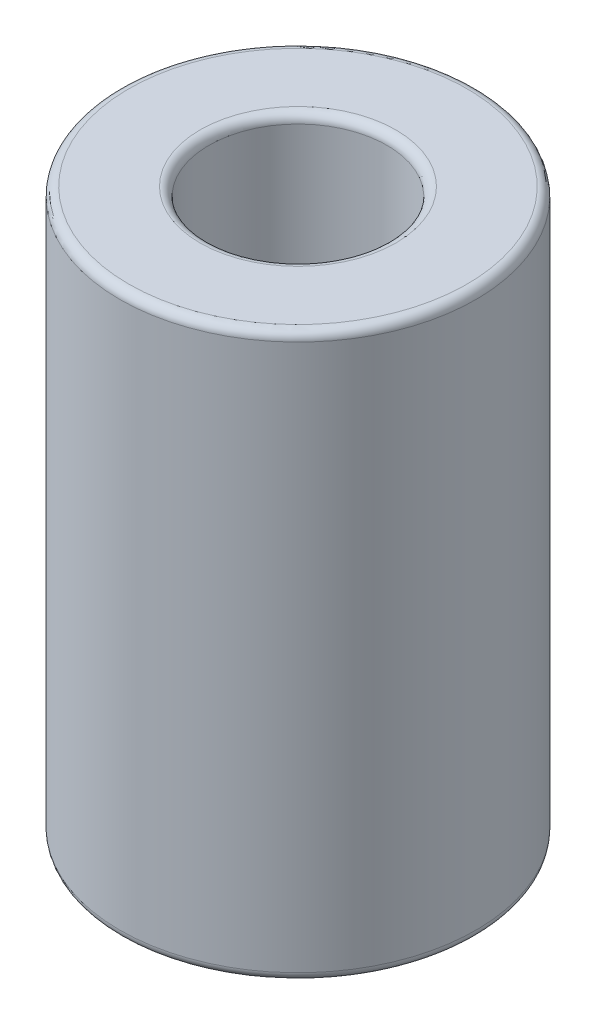
ISO-10303-21;
HEADER;
FILE_DESCRIPTION(('STEP AP214'),'2;1');
FILE_NAME('part.step','',(''),(''),'','','');
FILE_SCHEMA(('AUTOMOTIVE_DESIGN { 1 0 10303 214 1 1 1 1 }'));
ENDSEC;
DATA;
#1=APPLICATION_CONTEXT('core data for automotive mechanical design processes');
#2=APPLICATION_PROTOCOL_DEFINITION('international standard','automotive_design',2000,#1);
#3=PRODUCT_CONTEXT('',#1,'mechanical');
#4=PRODUCT('Part','Part','',(#3));
#5=PRODUCT_RELATED_PRODUCT_CATEGORY('part','',(#4));
#6=PRODUCT_DEFINITION_FORMATION('','',#4);
#7=PRODUCT_DEFINITION_CONTEXT('part definition',#1,'design');
#8=PRODUCT_DEFINITION('design','',#6,#7);
#9=PRODUCT_DEFINITION_SHAPE('','',#8);
#10=(LENGTH_UNIT() NAMED_UNIT(*) SI_UNIT(.MILLI.,.METRE.));
#11=(NAMED_UNIT(*) PLANE_ANGLE_UNIT() SI_UNIT($,.RADIAN.));
#12=(NAMED_UNIT(*) SI_UNIT($,.STERADIAN.) SOLID_ANGLE_UNIT());
#13=UNCERTAINTY_MEASURE_WITH_UNIT(LENGTH_MEASURE(1.E-05),#10,'distance_accuracy_value','');
#14=(GEOMETRIC_REPRESENTATION_CONTEXT(3) GLOBAL_UNCERTAINTY_ASSIGNED_CONTEXT((#13)) GLOBAL_UNIT_ASSIGNED_CONTEXT((#10,
#11,#12)) REPRESENTATION_CONTEXT('',''));
#15=CARTESIAN_POINT('',(0.,0.,0.));
#16=DIRECTION('',(0.,0.,1.));
#17=DIRECTION('',(1.,0.,0.));
#18=AXIS2_PLACEMENT_3D('',#15,#16,#17);
#19=CARTESIAN_POINT('',(0.,19.,0.));
#20=DIRECTION('',(0.,1.,0.));
#21=DIRECTION('',(0.,0.,1.));
#22=AXIS2_PLACEMENT_3D('',#19,#20,#21);
#23=PLANE('',#22);
#24=CARTESIAN_POINT('',(0.,19.,0.));
#25=DIRECTION('',(0.,1.,0.));
#26=DIRECTION('',(0.,0.,1.));
#27=AXIS2_PLACEMENT_3D('',#24,#25,#26);
#28=CIRCLE('',#27,3.3);
#29=CARTESIAN_POINT('',(0.,19.,3.3));
#30=VERTEX_POINT('',#29);
#31=EDGE_CURVE('E10',#30,#30,#28,.F.);
#32=ORIENTED_EDGE('',*,*,#31,.T.);
#33=EDGE_LOOP('',(#32));
#34=FACE_BOUND('',#33,.T.);
#35=CARTESIAN_POINT('',(0.,19.,0.));
#36=DIRECTION('',(0.,1.,0.));
#37=DIRECTION('',(0.,0.,1.));
#38=AXIS2_PLACEMENT_3D('',#35,#36,#37);
#39=CIRCLE('',#38,5.7);
#40=CARTESIAN_POINT('',(0.,19.,5.7));
#41=VERTEX_POINT('',#40);
#42=EDGE_CURVE('E37',#41,#41,#39,.T.);
#43=ORIENTED_EDGE('',*,*,#42,.T.);
#44=EDGE_LOOP('',(#43));
#45=FACE_BOUND('',#44,.T.);
#46=ADVANCED_FACE('F30',(#34,#45),#23,.T.);
#47=CARTESIAN_POINT('',(0.,0.,0.));
#48=DIRECTION('',(0.,1.,0.));
#49=DIRECTION('',(0.,0.,1.));
#50=AXIS2_PLACEMENT_3D('',#47,#48,#49);
#51=PLANE('',#50);
#52=CARTESIAN_POINT('',(0.,0.,0.));
#53=DIRECTION('',(0.,1.,0.));
#54=DIRECTION('',(0.,0.,1.));
#55=AXIS2_PLACEMENT_3D('',#52,#53,#54);
#56=CIRCLE('',#55,5.7);
#57=CARTESIAN_POINT('',(0.,0.,5.7));
#58=VERTEX_POINT('',#57);
#59=EDGE_CURVE('E50',#58,#58,#56,.F.);
#60=ORIENTED_EDGE('',*,*,#59,.T.);
#61=EDGE_LOOP('',(#60));
#62=FACE_BOUND('',#61,.T.);
#63=CARTESIAN_POINT('',(0.,0.,0.));
#64=DIRECTION('',(0.,1.,0.));
#65=DIRECTION('',(0.,0.,1.));
#66=AXIS2_PLACEMENT_3D('',#63,#64,#65);
#67=CIRCLE('',#66,3.3);
#68=CARTESIAN_POINT('',(0.,0.,3.3));
#69=VERTEX_POINT('',#68);
#70=EDGE_CURVE('E53',#69,#69,#67,.T.);
#71=ORIENTED_EDGE('',*,*,#70,.T.);
#72=EDGE_LOOP('',(#71));
#73=FACE_BOUND('',#72,.T.);
#74=ADVANCED_FACE('F74',(#62,#73),#51,.F.);
#75=CARTESIAN_POINT('',(0.,19.,0.));
#76=DIRECTION('',(0.,-1.,0.));
#77=DIRECTION('',(0.,0.,-1.));
#78=AXIS2_PLACEMENT_3D('',#75,#76,#77);
#79=CYLINDRICAL_SURFACE('',#78,6.);
#80=CARTESIAN_POINT('',(0.,0.300000000000002,0.));
#81=DIRECTION('',(0.,1.,0.));
#82=DIRECTION('',(0.,0.,1.));
#83=AXIS2_PLACEMENT_3D('',#80,#81,#82);
#84=CIRCLE('',#83,6.);
#85=CARTESIAN_POINT('',(0.,0.300000000000002,6.));
#86=VERTEX_POINT('',#85);
#87=EDGE_CURVE('E56',#86,#86,#84,.T.);
#88=ORIENTED_EDGE('',*,*,#87,.T.);
#89=EDGE_LOOP('',(#88));
#90=FACE_BOUND('',#89,.T.);
#91=CARTESIAN_POINT('',(0.,18.7,0.));
#92=DIRECTION('',(0.,1.,0.));
#93=DIRECTION('',(0.,0.,1.));
#94=AXIS2_PLACEMENT_3D('',#91,#92,#93);
#95=CIRCLE('',#94,6.);
#96=CARTESIAN_POINT('',(0.,18.7,6.));
#97=VERTEX_POINT('',#96);
#98=EDGE_CURVE('E59',#97,#97,#95,.F.);
#99=ORIENTED_EDGE('',*,*,#98,.T.);
#100=EDGE_LOOP('',(#99));
#101=FACE_BOUND('',#100,.T.);
#102=ADVANCED_FACE('F63',(#90,#101),#79,.T.);
#103=CARTESIAN_POINT('',(0.,19.,0.));
#104=DIRECTION('',(0.,-1.,0.));
#105=DIRECTION('',(0.,0.,-1.));
#106=AXIS2_PLACEMENT_3D('',#103,#104,#105);
#107=CYLINDRICAL_SURFACE('',#106,3.);
#108=CARTESIAN_POINT('',(0.,0.300000000000002,0.));
#109=DIRECTION('',(0.,1.,0.));
#110=DIRECTION('',(0.,0.,1.));
#111=AXIS2_PLACEMENT_3D('',#108,#109,#110);
#112=CIRCLE('',#111,3.);
#113=CARTESIAN_POINT('',(0.,0.300000000000002,3.));
#114=VERTEX_POINT('',#113);
#115=EDGE_CURVE('E41',#114,#114,#112,.F.);
#116=ORIENTED_EDGE('',*,*,#115,.T.);
#117=EDGE_LOOP('',(#116));
#118=FACE_BOUND('',#117,.T.);
#119=CARTESIAN_POINT('',(0.,18.7,0.));
#120=DIRECTION('',(0.,1.,0.));
#121=DIRECTION('',(0.,0.,1.));
#122=AXIS2_PLACEMENT_3D('',#119,#120,#121);
#123=CIRCLE('',#122,3.);
#124=CARTESIAN_POINT('',(0.,18.7,3.));
#125=VERTEX_POINT('',#124);
#126=EDGE_CURVE('E45',#125,#125,#123,.T.);
#127=ORIENTED_EDGE('',*,*,#126,.T.);
#128=EDGE_LOOP('',(#127));
#129=FACE_BOUND('',#128,.T.);
#130=ADVANCED_FACE('F82',(#118,#129),#107,.F.);
#131=CARTESIAN_POINT('',(0.,0.300000000000002,0.));
#132=DIRECTION('',(0.,1.,0.));
#133=DIRECTION('',(0.,0.,1.));
#134=AXIS2_PLACEMENT_3D('',#131,#132,#133);
#135=TOROIDAL_SURFACE('',#134,5.7,0.3);
#136=ORIENTED_EDGE('',*,*,#59,.F.);
#137=EDGE_LOOP('',(#136));
#138=FACE_BOUND('',#137,.T.);
#139=ORIENTED_EDGE('',*,*,#87,.F.);
#140=EDGE_LOOP('',(#139));
#141=FACE_BOUND('',#140,.T.);
#142=ADVANCED_FACE('F87',(#138,#141),#135,.T.);
#143=CARTESIAN_POINT('',(0.,0.300000000000002,0.));
#144=DIRECTION('',(0.,1.,0.));
#145=DIRECTION('',(0.,0.,1.));
#146=AXIS2_PLACEMENT_3D('',#143,#144,#145);
#147=TOROIDAL_SURFACE('',#146,3.3,0.3);
#148=ORIENTED_EDGE('',*,*,#115,.F.);
#149=EDGE_LOOP('',(#148));
#150=FACE_BOUND('',#149,.T.);
#151=ORIENTED_EDGE('',*,*,#70,.F.);
#152=EDGE_LOOP('',(#151));
#153=FACE_BOUND('',#152,.T.);
#154=ADVANCED_FACE('F71',(#150,#153),#147,.T.);
#155=CARTESIAN_POINT('',(0.,18.7,0.));
#156=DIRECTION('',(0.,1.,0.));
#157=DIRECTION('',(0.,0.,1.));
#158=AXIS2_PLACEMENT_3D('',#155,#156,#157);
#159=TOROIDAL_SURFACE('',#158,3.3,0.3);
#160=ORIENTED_EDGE('',*,*,#31,.F.);
#161=EDGE_LOOP('',(#160));
#162=FACE_BOUND('',#161,.T.);
#163=ORIENTED_EDGE('',*,*,#126,.F.);
#164=EDGE_LOOP('',(#163));
#165=FACE_BOUND('',#164,.T.);
#166=ADVANCED_FACE('F67',(#162,#165),#159,.T.);
#167=CARTESIAN_POINT('',(0.,18.7,0.));
#168=DIRECTION('',(0.,1.,0.));
#169=DIRECTION('',(0.,0.,1.));
#170=AXIS2_PLACEMENT_3D('',#167,#168,#169);
#171=TOROIDAL_SURFACE('',#170,5.7,0.3);
#172=ORIENTED_EDGE('',*,*,#98,.F.);
#173=EDGE_LOOP('',(#172));
#174=FACE_BOUND('',#173,.T.);
#175=ORIENTED_EDGE('',*,*,#42,.F.);
#176=EDGE_LOOP('',(#175));
#177=FACE_BOUND('',#176,.T.);
#178=ADVANCED_FACE('F32',(#174,#177),#171,.T.);
#179=CLOSED_SHELL('',(#46,#74,#102,#130,#142,#154,#166,#178));
#180=MANIFOLD_SOLID_BREP('B2',#179);
#181=ADVANCED_BREP_SHAPE_REPRESENTATION('',(#18,#180),#14);
#182=SHAPE_DEFINITION_REPRESENTATION(#9,#181);
ENDSEC;
END-ISO-10303-21;
